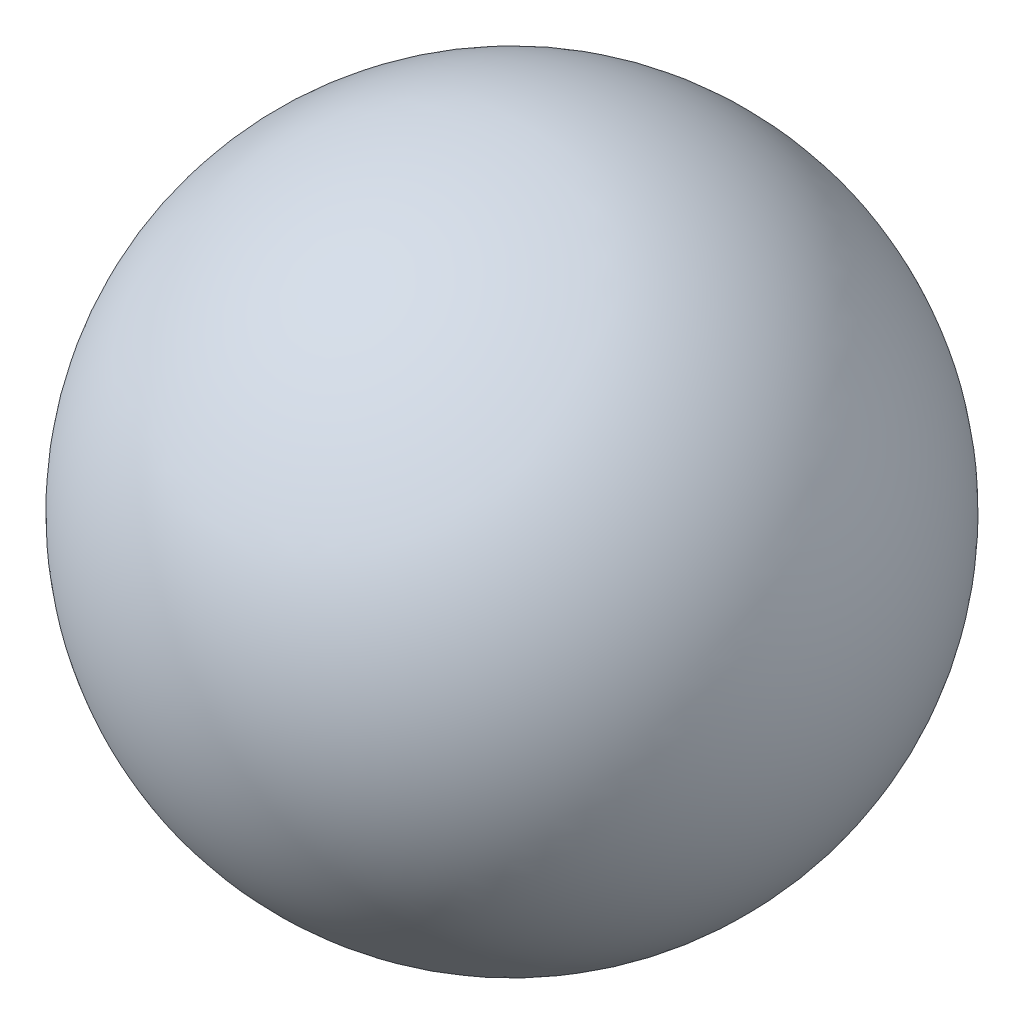
ISO-10303-21;
HEADER;
FILE_DESCRIPTION(('STEP AP214'),'2;1');
FILE_NAME('part.step','',(''),(''),'','','');
FILE_SCHEMA(('AUTOMOTIVE_DESIGN { 1 0 10303 214 1 1 1 1 }'));
ENDSEC;
DATA;
#1=APPLICATION_CONTEXT('core data for automotive mechanical design processes');
#2=APPLICATION_PROTOCOL_DEFINITION('international standard','automotive_design',2000,#1);
#3=PRODUCT_CONTEXT('',#1,'mechanical');
#4=PRODUCT('Part','Part','',(#3));
#5=PRODUCT_RELATED_PRODUCT_CATEGORY('part','',(#4));
#6=PRODUCT_DEFINITION_FORMATION('','',#4);
#7=PRODUCT_DEFINITION_CONTEXT('part definition',#1,'design');
#8=PRODUCT_DEFINITION('design','',#6,#7);
#9=PRODUCT_DEFINITION_SHAPE('','',#8);
#10=(LENGTH_UNIT() NAMED_UNIT(*) SI_UNIT(.MILLI.,.METRE.));
#11=(NAMED_UNIT(*) PLANE_ANGLE_UNIT() SI_UNIT($,.RADIAN.));
#12=(NAMED_UNIT(*) SI_UNIT($,.STERADIAN.) SOLID_ANGLE_UNIT());
#13=UNCERTAINTY_MEASURE_WITH_UNIT(LENGTH_MEASURE(1.E-05),#10,'distance_accuracy_value','');
#14=(GEOMETRIC_REPRESENTATION_CONTEXT(3) GLOBAL_UNCERTAINTY_ASSIGNED_CONTEXT((#13)) GLOBAL_UNIT_ASSIGNED_CONTEXT((#10,
#11,#12)) REPRESENTATION_CONTEXT('',''));
#15=CARTESIAN_POINT('',(0.,0.,0.));
#16=DIRECTION('',(0.,0.,1.));
#17=DIRECTION('',(1.,0.,0.));
#18=AXIS2_PLACEMENT_3D('',#15,#16,#17);
#19=CARTESIAN_POINT('',(0.,0.,0.));
#20=DIRECTION('',(0.,0.,-1.));
#21=DIRECTION('',(1.,0.,0.));
#22=AXIS2_PLACEMENT_3D('',#19,#20,#21);
#23=SPHERICAL_SURFACE('',#22,165.1);
#24=CARTESIAN_POINT('',(0.,0.,-165.1));
#25=VERTEX_POINT('',#24);
#26=VERTEX_LOOP('',#25);
#27=FACE_BOUND('',#26,.T.);
#28=ADVANCED_FACE('F33',(#27),#23,.T.);
#29=CLOSED_SHELL('',(#28));
#30=MANIFOLD_SOLID_BREP('B2',#29);
#31=ADVANCED_BREP_SHAPE_REPRESENTATION('',(#18,#30),#14);
#32=SHAPE_DEFINITION_REPRESENTATION(#9,#31);
ENDSEC;
END-ISO-10303-21;
